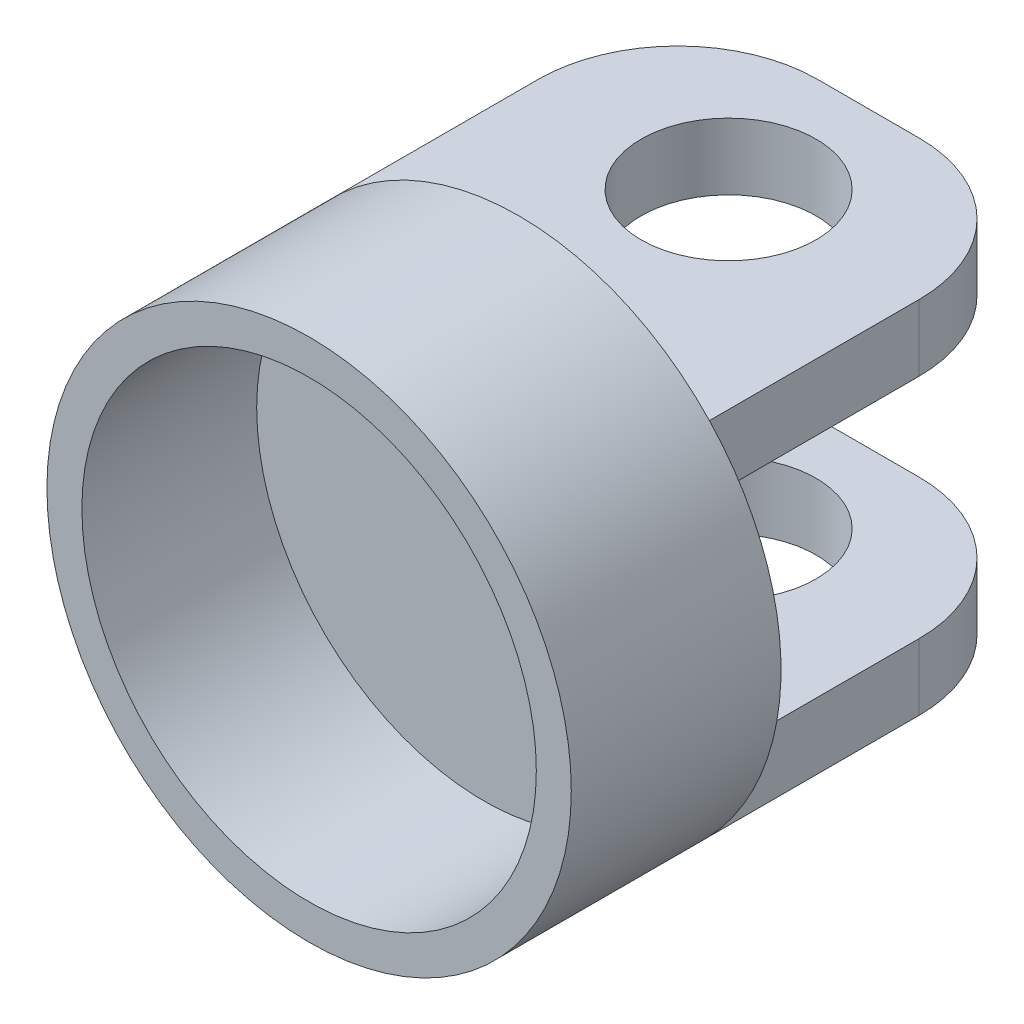
ISO-10303-21;
HEADER;
FILE_DESCRIPTION(('STEP AP214'),'2;1');
FILE_NAME('part.step','',(''),(''),'','','');
FILE_SCHEMA(('AUTOMOTIVE_DESIGN { 1 0 10303 214 1 1 1 1 }'));
ENDSEC;
DATA;
#1=APPLICATION_CONTEXT('core data for automotive mechanical design processes');
#2=APPLICATION_PROTOCOL_DEFINITION('international standard','automotive_design',2000,#1);
#3=PRODUCT_CONTEXT('',#1,'mechanical');
#4=PRODUCT('Part','Part','',(#3));
#5=PRODUCT_RELATED_PRODUCT_CATEGORY('part','',(#4));
#6=PRODUCT_DEFINITION_FORMATION('','',#4);
#7=PRODUCT_DEFINITION_CONTEXT('part definition',#1,'design');
#8=PRODUCT_DEFINITION('design','',#6,#7);
#9=PRODUCT_DEFINITION_SHAPE('','',#8);
#10=(LENGTH_UNIT() NAMED_UNIT(*) SI_UNIT(.MILLI.,.METRE.));
#11=(NAMED_UNIT(*) PLANE_ANGLE_UNIT() SI_UNIT($,.RADIAN.));
#12=(NAMED_UNIT(*) SI_UNIT($,.STERADIAN.) SOLID_ANGLE_UNIT());
#13=UNCERTAINTY_MEASURE_WITH_UNIT(LENGTH_MEASURE(1.E-05),#10,'distance_accuracy_value','');
#14=(GEOMETRIC_REPRESENTATION_CONTEXT(3) GLOBAL_UNCERTAINTY_ASSIGNED_CONTEXT((#13)) GLOBAL_UNIT_ASSIGNED_CONTEXT((#10,
#11,#12)) REPRESENTATION_CONTEXT('',''));
#15=CARTESIAN_POINT('',(0.,0.,0.));
#16=DIRECTION('',(0.,0.,1.));
#17=DIRECTION('',(1.,0.,0.));
#18=AXIS2_PLACEMENT_3D('',#15,#16,#17);
#19=CARTESIAN_POINT('',(0.,0.,-2.));
#20=DIRECTION('',(0.,0.,-1.));
#21=DIRECTION('',(-1.,0.,0.));
#22=AXIS2_PLACEMENT_3D('',#19,#20,#21);
#23=PLANE('',#22);
#24=DIRECTION('',(0.,1.,0.));
#25=VECTOR('',#24,1.);
#26=CARTESIAN_POINT('',(-10.9017957432066,0.,-2.));
#27=LINE('',#26,#25);
#28=CARTESIAN_POINT('',(-10.9017957432066,6.5,-2.));
#29=VERTEX_POINT('',#28);
#30=CARTESIAN_POINT('',(-10.9017957432066,10.3029534393494,-2.));
#31=VERTEX_POINT('',#30);
#32=EDGE_CURVE('E149',#29,#31,#27,.T.);
#33=ORIENTED_EDGE('',*,*,#32,.F.);
#34=DIRECTION('',(-1.,0.,0.));
#35=VECTOR('',#34,1.);
#36=CARTESIAN_POINT('',(0.,6.5,-2.));
#37=LINE('',#36,#35);
#38=CARTESIAN_POINT('',(10.9017957432066,6.5,-2.));
#39=VERTEX_POINT('',#38);
#40=EDGE_CURVE('E131',#39,#29,#37,.T.);
#41=ORIENTED_EDGE('',*,*,#40,.F.);
#42=DIRECTION('',(0.,1.,0.));
#43=VECTOR('',#42,1.);
#44=CARTESIAN_POINT('',(10.9017957432066,0.,-2.));
#45=LINE('',#44,#43);
#46=CARTESIAN_POINT('',(10.9017957432066,10.3029534393494,-2.));
#47=VERTEX_POINT('',#46);
#48=EDGE_CURVE('E145',#39,#47,#45,.T.);
#49=ORIENTED_EDGE('',*,*,#48,.T.);
#50=CARTESIAN_POINT('',(0.,0.,-2.));
#51=DIRECTION('',(0.,0.,-1.));
#52=DIRECTION('',(-1.,0.,0.));
#53=AXIS2_PLACEMENT_3D('',#50,#51,#52);
#54=CIRCLE('',#53,15.);
#55=CARTESIAN_POINT('',(10.9017957432066,-10.3029534393494,-2.));
#56=VERTEX_POINT('',#55);
#57=EDGE_CURVE('E193',#47,#56,#54,.T.);
#58=ORIENTED_EDGE('',*,*,#57,.T.);
#59=DIRECTION('',(0.,-1.,0.));
#60=VECTOR('',#59,1.);
#61=CARTESIAN_POINT('',(10.9017957432066,0.,-2.));
#62=LINE('',#61,#60);
#63=CARTESIAN_POINT('',(10.9017957432066,-6.5,-2.));
#64=VERTEX_POINT('',#63);
#65=EDGE_CURVE('E178',#64,#56,#62,.T.);
#66=ORIENTED_EDGE('',*,*,#65,.F.);
#67=DIRECTION('',(-1.,0.,0.));
#68=VECTOR('',#67,1.);
#69=CARTESIAN_POINT('',(0.,-6.5,-2.));
#70=LINE('',#69,#68);
#71=CARTESIAN_POINT('',(-10.9017957432066,-6.5,-2.));
#72=VERTEX_POINT('',#71);
#73=EDGE_CURVE('E168',#64,#72,#70,.T.);
#74=ORIENTED_EDGE('',*,*,#73,.T.);
#75=DIRECTION('',(0.,-1.,0.));
#76=VECTOR('',#75,1.);
#77=CARTESIAN_POINT('',(-10.9017957432066,0.,-2.));
#78=LINE('',#77,#76);
#79=CARTESIAN_POINT('',(-10.9017957432066,-10.3029534393494,-2.));
#80=VERTEX_POINT('',#79);
#81=EDGE_CURVE('E172',#72,#80,#78,.T.);
#82=ORIENTED_EDGE('',*,*,#81,.T.);
#83=EDGE_CURVE('E198',#80,#31,#54,.T.);
#84=ORIENTED_EDGE('',*,*,#83,.T.);
#85=EDGE_LOOP('',(#33,#41,#49,#58,#66,#74,#82,#84));
#86=FACE_BOUND('',#85,.T.);
#87=ADVANCED_FACE('F35',(#86),#23,.T.);
#88=DIRECTION('',(-1.,0.,0.));
#89=VECTOR('',#88,1.);
#90=CARTESIAN_POINT('',(0.,10.3029534393494,-2.));
#91=LINE('',#90,#89);
#92=EDGE_CURVE('E155',#47,#31,#91,.T.);
#93=ORIENTED_EDGE('',*,*,#92,.T.);
#94=EDGE_CURVE('E502',#31,#47,#54,.T.);
#95=ORIENTED_EDGE('',*,*,#94,.T.);
#96=EDGE_LOOP('',(#93,#95));
#97=FACE_BOUND('',#96,.T.);
#98=ADVANCED_FACE('F274',(#97),#23,.T.);
#99=CARTESIAN_POINT('',(0.,0.,10.));
#100=DIRECTION('',(0.,0.,1.));
#101=DIRECTION('',(1.,0.,0.));
#102=AXIS2_PLACEMENT_3D('',#99,#100,#101);
#103=PLANE('',#102);
#104=CARTESIAN_POINT('',(0.,0.,10.));
#105=DIRECTION('',(0.,0.,1.));
#106=DIRECTION('',(1.,0.,0.));
#107=AXIS2_PLACEMENT_3D('',#104,#105,#106);
#108=CIRCLE('',#107,15.);
#109=CARTESIAN_POINT('',(15.,0.,10.));
#110=VERTEX_POINT('',#109);
#111=EDGE_CURVE('E202',#110,#110,#108,.T.);
#112=ORIENTED_EDGE('',*,*,#111,.T.);
#113=EDGE_LOOP('',(#112));
#114=FACE_BOUND('',#113,.T.);
#115=CARTESIAN_POINT('',(0.,0.,10.));
#116=DIRECTION('',(0.,0.,1.));
#117=DIRECTION('',(1.,0.,0.));
#118=AXIS2_PLACEMENT_3D('',#115,#116,#117);
#119=CIRCLE('',#118,13.);
#120=CARTESIAN_POINT('',(13.,0.,10.));
#121=VERTEX_POINT('',#120);
#122=EDGE_CURVE('E199',#121,#121,#119,.T.);
#123=ORIENTED_EDGE('',*,*,#122,.F.);
#124=EDGE_LOOP('',(#123));
#125=FACE_BOUND('',#124,.T.);
#126=ADVANCED_FACE('F280',(#114,#125),#103,.T.);
#127=CARTESIAN_POINT('',(0.,0.,10.));
#128=DIRECTION('',(0.,0.,-1.));
#129=DIRECTION('',(-1.,0.,0.));
#130=AXIS2_PLACEMENT_3D('',#127,#128,#129);
#131=CYLINDRICAL_SURFACE('',#130,15.);
#132=ORIENTED_EDGE('',*,*,#111,.F.);
#133=EDGE_LOOP('',(#132));
#134=FACE_BOUND('',#133,.T.);
#135=EDGE_CURVE('E194',#56,#80,#54,.T.);
#136=ORIENTED_EDGE('',*,*,#135,.F.);
#137=ORIENTED_EDGE('',*,*,#57,.F.);
#138=ORIENTED_EDGE('',*,*,#94,.F.);
#139=ORIENTED_EDGE('',*,*,#83,.F.);
#140=EDGE_LOOP('',(#136,#137,#138,#139));
#141=FACE_BOUND('',#140,.T.);
#142=ADVANCED_FACE('F327',(#134,#141),#131,.T.);
#143=CARTESIAN_POINT('',(0.,0.,10.));
#144=DIRECTION('',(0.,0.,-1.));
#145=DIRECTION('',(-1.,0.,0.));
#146=AXIS2_PLACEMENT_3D('',#143,#144,#145);
#147=CYLINDRICAL_SURFACE('',#146,13.);
#148=ORIENTED_EDGE('',*,*,#122,.T.);
#149=EDGE_LOOP('',(#148));
#150=FACE_BOUND('',#149,.T.);
#151=CARTESIAN_POINT('',(0.,0.,0.));
#152=DIRECTION('',(0.,0.,1.));
#153=DIRECTION('',(1.,0.,0.));
#154=AXIS2_PLACEMENT_3D('',#151,#152,#153);
#155=CIRCLE('',#154,13.);
#156=CARTESIAN_POINT('',(13.,0.,0.));
#157=VERTEX_POINT('',#156);
#158=EDGE_CURVE('E197',#157,#157,#155,.T.);
#159=ORIENTED_EDGE('',*,*,#158,.F.);
#160=EDGE_LOOP('',(#159));
#161=FACE_BOUND('',#160,.T.);
#162=ADVANCED_FACE('F294',(#150,#161),#147,.F.);
#163=CARTESIAN_POINT('',(0.,0.,0.));
#164=DIRECTION('',(0.,0.,-1.));
#165=DIRECTION('',(-1.,0.,0.));
#166=AXIS2_PLACEMENT_3D('',#163,#164,#165);
#167=PLANE('',#166);
#168=ORIENTED_EDGE('',*,*,#158,.T.);
#169=EDGE_LOOP('',(#168));
#170=FACE_BOUND('',#169,.T.);
#171=ADVANCED_FACE('F286',(#170),#167,.F.);
#172=DIRECTION('',(-1.,0.,0.));
#173=VECTOR('',#172,1.);
#174=CARTESIAN_POINT('',(0.,-10.3029534393494,-2.));
#175=LINE('',#174,#173);
#176=EDGE_CURVE('E181',#56,#80,#175,.T.);
#177=ORIENTED_EDGE('',*,*,#176,.F.);
#178=ORIENTED_EDGE('',*,*,#135,.T.);
#179=EDGE_LOOP('',(#177,#178));
#180=FACE_BOUND('',#179,.T.);
#181=ADVANCED_FACE('F276',(#180),#23,.T.);
#182=CARTESIAN_POINT('',(0.,-6.5,-22.));
#183=DIRECTION('',(0.,1.,0.));
#184=DIRECTION('',(0.,0.,1.));
#185=AXIS2_PLACEMENT_3D('',#182,#183,#184);
#186=PLANE('',#185);
#187=CARTESIAN_POINT('',(0.,-6.5,-14.));
#188=DIRECTION('',(0.,1.,0.));
#189=DIRECTION('',(0.,0.,1.));
#190=AXIS2_PLACEMENT_3D('',#187,#188,#189);
#191=CIRCLE('',#190,5.);
#192=CARTESIAN_POINT('',(0.,-6.5,-8.99999999999999));
#193=VERTEX_POINT('',#192);
#194=EDGE_CURVE('E150',#193,#193,#191,.T.);
#195=ORIENTED_EDGE('',*,*,#194,.F.);
#196=EDGE_LOOP('',(#195));
#197=FACE_BOUND('',#196,.T.);
#198=DIRECTION('',(0.,0.,1.));
#199=VECTOR('',#198,1.);
#200=CARTESIAN_POINT('',(10.9017957432066,-6.5,-22.));
#201=LINE('',#200,#199);
#202=CARTESIAN_POINT('',(10.9017957432066,-6.5,-14.));
#203=VERTEX_POINT('',#202);
#204=EDGE_CURVE('E191',#203,#64,#201,.T.);
#205=ORIENTED_EDGE('',*,*,#204,.F.);
#206=CARTESIAN_POINT('',(2.90179574320663,-6.5,-14.));
#207=DIRECTION('',(0.,1.,0.));
#208=DIRECTION('',(0.,0.,1.));
#209=AXIS2_PLACEMENT_3D('',#206,#207,#208);
#210=CIRCLE('',#209,8.);
#211=CARTESIAN_POINT('',(2.90179574320663,-6.5,-22.));
#212=VERTEX_POINT('',#211);
#213=EDGE_CURVE('E232',#203,#212,#210,.T.);
#214=ORIENTED_EDGE('',*,*,#213,.T.);
#215=DIRECTION('',(-1.,0.,0.));
#216=VECTOR('',#215,1.);
#217=CARTESIAN_POINT('',(0.,-6.5,-22.));
#218=LINE('',#217,#216);
#219=CARTESIAN_POINT('',(-2.90179574320664,-6.5,-22.));
#220=VERTEX_POINT('',#219);
#221=EDGE_CURVE('E169',#212,#220,#218,.T.);
#222=ORIENTED_EDGE('',*,*,#221,.T.);
#223=CARTESIAN_POINT('',(-2.90179574320664,-6.5,-14.));
#224=DIRECTION('',(0.,1.,0.));
#225=DIRECTION('',(0.,0.,1.));
#226=AXIS2_PLACEMENT_3D('',#223,#224,#225);
#227=CIRCLE('',#226,8.);
#228=CARTESIAN_POINT('',(-10.9017957432066,-6.5,-14.));
#229=VERTEX_POINT('',#228);
#230=EDGE_CURVE('E50',#220,#229,#227,.T.);
#231=ORIENTED_EDGE('',*,*,#230,.T.);
#232=DIRECTION('',(0.,0.,1.));
#233=VECTOR('',#232,1.);
#234=CARTESIAN_POINT('',(-10.9017957432066,-6.5,-22.));
#235=LINE('',#234,#233);
#236=EDGE_CURVE('E175',#229,#72,#235,.T.);
#237=ORIENTED_EDGE('',*,*,#236,.T.);
#238=ORIENTED_EDGE('',*,*,#73,.F.);
#239=EDGE_LOOP('',(#205,#214,#222,#231,#237,#238));
#240=FACE_BOUND('',#239,.T.);
#241=ADVANCED_FACE('F285',(#197,#240),#186,.T.);
#242=CARTESIAN_POINT('',(10.9017957432066,0.,-22.));
#243=DIRECTION('',(-1.,0.,0.));
#244=DIRECTION('',(0.,0.,1.));
#245=AXIS2_PLACEMENT_3D('',#242,#243,#244);
#246=PLANE('',#245);
#247=DIRECTION('',(0.,0.,1.));
#248=VECTOR('',#247,1.);
#249=CARTESIAN_POINT('',(10.9017957432066,-10.3029534393494,-22.));
#250=LINE('',#249,#248);
#251=CARTESIAN_POINT('',(10.9017957432066,-10.3029534393494,-14.));
#252=VERTEX_POINT('',#251);
#253=EDGE_CURVE('E189',#252,#56,#250,.T.);
#254=ORIENTED_EDGE('',*,*,#253,.F.);
#255=DIRECTION('',(0.,-1.,0.));
#256=VECTOR('',#255,1.);
#257=CARTESIAN_POINT('',(10.9017957432066,-6.5,-14.));
#258=LINE('',#257,#256);
#259=EDGE_CURVE('E58',#252,#203,#258,.F.);
#260=ORIENTED_EDGE('',*,*,#259,.T.);
#261=ORIENTED_EDGE('',*,*,#204,.T.);
#262=ORIENTED_EDGE('',*,*,#65,.T.);
#263=EDGE_LOOP('',(#254,#260,#261,#262));
#264=FACE_BOUND('',#263,.T.);
#265=ADVANCED_FACE('F292',(#264),#246,.F.);
#266=CARTESIAN_POINT('',(0.,-10.3029534393494,-22.));
#267=DIRECTION('',(0.,1.,0.));
#268=DIRECTION('',(0.,0.,1.));
#269=AXIS2_PLACEMENT_3D('',#266,#267,#268);
#270=PLANE('',#269);
#271=CARTESIAN_POINT('',(0.,-10.3029534393494,-14.));
#272=DIRECTION('',(0.,1.,0.));
#273=DIRECTION('',(0.,0.,1.));
#274=AXIS2_PLACEMENT_3D('',#271,#272,#273);
#275=CIRCLE('',#274,5.);
#276=CARTESIAN_POINT('',(0.,-10.3029534393494,-8.99999999999999));
#277=VERTEX_POINT('',#276);
#278=EDGE_CURVE('E255',#277,#277,#275,.F.);
#279=ORIENTED_EDGE('',*,*,#278,.F.);
#280=EDGE_LOOP('',(#279));
#281=FACE_BOUND('',#280,.T.);
#282=DIRECTION('',(-1.,0.,0.));
#283=VECTOR('',#282,1.);
#284=CARTESIAN_POINT('',(0.,-10.3029534393494,-22.));
#285=LINE('',#284,#283);
#286=CARTESIAN_POINT('',(2.90179574320663,-10.3029534393494,-22.));
#287=VERTEX_POINT('',#286);
#288=CARTESIAN_POINT('',(-2.90179574320664,-10.3029534393494,-22.));
#289=VERTEX_POINT('',#288);
#290=EDGE_CURVE('E171',#287,#289,#285,.T.);
#291=ORIENTED_EDGE('',*,*,#290,.F.);
#292=CARTESIAN_POINT('',(2.90179574320663,-10.3029534393494,-14.));
#293=DIRECTION('',(0.,1.,0.));
#294=DIRECTION('',(0.,0.,1.));
#295=AXIS2_PLACEMENT_3D('',#292,#293,#294);
#296=CIRCLE('',#295,8.);
#297=EDGE_CURVE('E228',#287,#252,#296,.F.);
#298=ORIENTED_EDGE('',*,*,#297,.T.);
#299=ORIENTED_EDGE('',*,*,#253,.T.);
#300=ORIENTED_EDGE('',*,*,#176,.T.);
#301=DIRECTION('',(0.,0.,1.));
#302=VECTOR('',#301,1.);
#303=CARTESIAN_POINT('',(-10.9017957432066,-10.3029534393494,-22.));
#304=LINE('',#303,#302);
#305=CARTESIAN_POINT('',(-10.9017957432066,-10.3029534393494,-14.));
#306=VERTEX_POINT('',#305);
#307=EDGE_CURVE('E187',#306,#80,#304,.T.);
#308=ORIENTED_EDGE('',*,*,#307,.F.);
#309=CARTESIAN_POINT('',(-2.90179574320664,-10.3029534393494,-14.));
#310=DIRECTION('',(0.,1.,0.));
#311=DIRECTION('',(0.,0.,1.));
#312=AXIS2_PLACEMENT_3D('',#309,#310,#311);
#313=CIRCLE('',#312,8.);
#314=EDGE_CURVE('E226',#306,#289,#313,.F.);
#315=ORIENTED_EDGE('',*,*,#314,.T.);
#316=EDGE_LOOP('',(#291,#298,#299,#300,#308,#315));
#317=FACE_BOUND('',#316,.T.);
#318=ADVANCED_FACE('F310',(#281,#317),#270,.F.);
#319=CARTESIAN_POINT('',(-10.9017957432066,0.,-22.));
#320=DIRECTION('',(-1.,0.,0.));
#321=DIRECTION('',(0.,0.,1.));
#322=AXIS2_PLACEMENT_3D('',#319,#320,#321);
#323=PLANE('',#322);
#324=ORIENTED_EDGE('',*,*,#236,.F.);
#325=DIRECTION('',(0.,-1.,0.));
#326=VECTOR('',#325,1.);
#327=CARTESIAN_POINT('',(-10.9017957432066,0.,-14.));
#328=LINE('',#327,#326);
#329=EDGE_CURVE('E11',#229,#306,#328,.T.);
#330=ORIENTED_EDGE('',*,*,#329,.T.);
#331=ORIENTED_EDGE('',*,*,#307,.T.);
#332=ORIENTED_EDGE('',*,*,#81,.F.);
#333=EDGE_LOOP('',(#324,#330,#331,#332));
#334=FACE_BOUND('',#333,.T.);
#335=ADVANCED_FACE('F306',(#334),#323,.T.);
#336=CARTESIAN_POINT('',(0.,0.,-22.));
#337=DIRECTION('',(0.,0.,-1.));
#338=DIRECTION('',(-1.,0.,0.));
#339=AXIS2_PLACEMENT_3D('',#336,#337,#338);
#340=PLANE('',#339);
#341=ORIENTED_EDGE('',*,*,#221,.F.);
#342=DIRECTION('',(0.,-1.,0.));
#343=VECTOR('',#342,1.);
#344=CARTESIAN_POINT('',(2.90179574320663,-10.3029534393494,-22.));
#345=LINE('',#344,#343);
#346=EDGE_CURVE('E223',#212,#287,#345,.T.);
#347=ORIENTED_EDGE('',*,*,#346,.T.);
#348=ORIENTED_EDGE('',*,*,#290,.T.);
#349=DIRECTION('',(0.,-1.,0.));
#350=VECTOR('',#349,1.);
#351=CARTESIAN_POINT('',(-2.90179574320664,0.,-22.));
#352=LINE('',#351,#350);
#353=EDGE_CURVE('E221',#289,#220,#352,.F.);
#354=ORIENTED_EDGE('',*,*,#353,.T.);
#355=EDGE_LOOP('',(#341,#347,#348,#354));
#356=FACE_BOUND('',#355,.T.);
#357=ADVANCED_FACE('F313',(#356),#340,.T.);
#358=CARTESIAN_POINT('',(0.,6.5,-22.));
#359=DIRECTION('',(0.,1.,0.));
#360=DIRECTION('',(0.,0.,1.));
#361=AXIS2_PLACEMENT_3D('',#358,#359,#360);
#362=PLANE('',#361);
#363=CARTESIAN_POINT('',(0.,6.5,-14.));
#364=DIRECTION('',(0.,1.,0.));
#365=DIRECTION('',(0.,0.,1.));
#366=AXIS2_PLACEMENT_3D('',#363,#364,#365);
#367=CIRCLE('',#366,5.);
#368=CARTESIAN_POINT('',(0.,6.5,-8.99999999999999));
#369=VERTEX_POINT('',#368);
#370=EDGE_CURVE('E252',#369,#369,#367,.T.);
#371=ORIENTED_EDGE('',*,*,#370,.T.);
#372=EDGE_LOOP('',(#371));
#373=FACE_BOUND('',#372,.T.);
#374=DIRECTION('',(-1.,0.,0.));
#375=VECTOR('',#374,1.);
#376=CARTESIAN_POINT('',(0.,6.5,-22.));
#377=LINE('',#376,#375);
#378=CARTESIAN_POINT('',(2.90179574320663,6.5,-22.));
#379=VERTEX_POINT('',#378);
#380=CARTESIAN_POINT('',(-2.90179574320664,6.5,-22.));
#381=VERTEX_POINT('',#380);
#382=EDGE_CURVE('E154',#379,#381,#377,.T.);
#383=ORIENTED_EDGE('',*,*,#382,.F.);
#384=CARTESIAN_POINT('',(2.90179574320663,6.5,-14.));
#385=DIRECTION('',(0.,1.,0.));
#386=DIRECTION('',(0.,0.,1.));
#387=AXIS2_PLACEMENT_3D('',#384,#385,#386);
#388=CIRCLE('',#387,8.);
#389=CARTESIAN_POINT('',(10.9017957432066,6.5,-14.));
#390=VERTEX_POINT('',#389);
#391=EDGE_CURVE('E133',#379,#390,#388,.F.);
#392=ORIENTED_EDGE('',*,*,#391,.T.);
#393=DIRECTION('',(0.,0.,1.));
#394=VECTOR('',#393,1.);
#395=CARTESIAN_POINT('',(10.9017957432066,6.5,-22.));
#396=LINE('',#395,#394);
#397=EDGE_CURVE('E126',#390,#39,#396,.T.);
#398=ORIENTED_EDGE('',*,*,#397,.T.);
#399=ORIENTED_EDGE('',*,*,#40,.T.);
#400=DIRECTION('',(0.,0.,1.));
#401=VECTOR('',#400,1.);
#402=CARTESIAN_POINT('',(-10.9017957432066,6.5,-22.));
#403=LINE('',#402,#401);
#404=CARTESIAN_POINT('',(-10.9017957432066,6.5,-14.));
#405=VERTEX_POINT('',#404);
#406=EDGE_CURVE('E166',#405,#29,#403,.T.);
#407=ORIENTED_EDGE('',*,*,#406,.F.);
#408=CARTESIAN_POINT('',(-2.90179574320664,6.5,-14.));
#409=DIRECTION('',(0.,1.,0.));
#410=DIRECTION('',(0.,0.,1.));
#411=AXIS2_PLACEMENT_3D('',#408,#409,#410);
#412=CIRCLE('',#411,8.);
#413=EDGE_CURVE('E218',#405,#381,#412,.F.);
#414=ORIENTED_EDGE('',*,*,#413,.T.);
#415=EDGE_LOOP('',(#383,#392,#398,#399,#407,#414));
#416=FACE_BOUND('',#415,.T.);
#417=ADVANCED_FACE('F129',(#373,#416),#362,.F.);
#418=CARTESIAN_POINT('',(-10.9017957432066,0.,-22.));
#419=DIRECTION('',(1.,0.,0.));
#420=DIRECTION('',(0.,0.,-1.));
#421=AXIS2_PLACEMENT_3D('',#418,#419,#420);
#422=PLANE('',#421);
#423=DIRECTION('',(0.,0.,1.));
#424=VECTOR('',#423,1.);
#425=CARTESIAN_POINT('',(-10.9017957432066,10.3029534393494,-22.));
#426=LINE('',#425,#424);
#427=CARTESIAN_POINT('',(-10.9017957432066,10.3029534393494,-14.));
#428=VERTEX_POINT('',#427);
#429=EDGE_CURVE('E164',#428,#31,#426,.T.);
#430=ORIENTED_EDGE('',*,*,#429,.F.);
#431=DIRECTION('',(0.,1.,0.));
#432=VECTOR('',#431,1.);
#433=CARTESIAN_POINT('',(-10.9017957432066,6.5,-14.));
#434=LINE('',#433,#432);
#435=EDGE_CURVE('E43',#428,#405,#434,.F.);
#436=ORIENTED_EDGE('',*,*,#435,.T.);
#437=ORIENTED_EDGE('',*,*,#406,.T.);
#438=ORIENTED_EDGE('',*,*,#32,.T.);
#439=EDGE_LOOP('',(#430,#436,#437,#438));
#440=FACE_BOUND('',#439,.T.);
#441=ADVANCED_FACE('F236',(#440),#422,.F.);
#442=CARTESIAN_POINT('',(0.,10.3029534393494,-22.));
#443=DIRECTION('',(0.,1.,0.));
#444=DIRECTION('',(0.,0.,1.));
#445=AXIS2_PLACEMENT_3D('',#442,#443,#444);
#446=PLANE('',#445);
#447=CARTESIAN_POINT('',(0.,10.3029534393494,-14.));
#448=DIRECTION('',(0.,1.,0.));
#449=DIRECTION('',(0.,0.,1.));
#450=AXIS2_PLACEMENT_3D('',#447,#448,#449);
#451=CIRCLE('',#450,5.);
#452=CARTESIAN_POINT('',(0.,10.3029534393494,-8.99999999999999));
#453=VERTEX_POINT('',#452);
#454=EDGE_CURVE('E258',#453,#453,#451,.T.);
#455=ORIENTED_EDGE('',*,*,#454,.F.);
#456=EDGE_LOOP('',(#455));
#457=FACE_BOUND('',#456,.T.);
#458=DIRECTION('',(0.,0.,1.));
#459=VECTOR('',#458,1.);
#460=CARTESIAN_POINT('',(10.9017957432066,10.3029534393494,-22.));
#461=LINE('',#460,#459);
#462=CARTESIAN_POINT('',(10.9017957432066,10.3029534393494,-14.));
#463=VERTEX_POINT('',#462);
#464=EDGE_CURVE('E138',#463,#47,#461,.T.);
#465=ORIENTED_EDGE('',*,*,#464,.F.);
#466=CARTESIAN_POINT('',(2.90179574320663,10.3029534393494,-14.));
#467=DIRECTION('',(0.,1.,0.));
#468=DIRECTION('',(0.,0.,1.));
#469=AXIS2_PLACEMENT_3D('',#466,#467,#468);
#470=CIRCLE('',#469,8.);
#471=CARTESIAN_POINT('',(2.90179574320663,10.3029534393494,-22.));
#472=VERTEX_POINT('',#471);
#473=EDGE_CURVE('E211',#463,#472,#470,.T.);
#474=ORIENTED_EDGE('',*,*,#473,.T.);
#475=DIRECTION('',(-1.,0.,0.));
#476=VECTOR('',#475,1.);
#477=CARTESIAN_POINT('',(0.,10.3029534393494,-22.));
#478=LINE('',#477,#476);
#479=CARTESIAN_POINT('',(-2.90179574320664,10.3029534393494,-22.));
#480=VERTEX_POINT('',#479);
#481=EDGE_CURVE('E139',#472,#480,#478,.T.);
#482=ORIENTED_EDGE('',*,*,#481,.T.);
#483=CARTESIAN_POINT('',(-2.90179574320664,10.3029534393494,-14.));
#484=DIRECTION('',(0.,1.,0.));
#485=DIRECTION('',(0.,0.,1.));
#486=AXIS2_PLACEMENT_3D('',#483,#484,#485);
#487=CIRCLE('',#486,8.);
#488=EDGE_CURVE('E209',#480,#428,#487,.T.);
#489=ORIENTED_EDGE('',*,*,#488,.T.);
#490=ORIENTED_EDGE('',*,*,#429,.T.);
#491=ORIENTED_EDGE('',*,*,#92,.F.);
#492=EDGE_LOOP('',(#465,#474,#482,#489,#490,#491));
#493=FACE_BOUND('',#492,.T.);
#494=ADVANCED_FACE('F247',(#457,#493),#446,.T.);
#495=CARTESIAN_POINT('',(10.9017957432066,0.,-22.));
#496=DIRECTION('',(1.,0.,0.));
#497=DIRECTION('',(0.,0.,-1.));
#498=AXIS2_PLACEMENT_3D('',#495,#496,#497);
#499=PLANE('',#498);
#500=ORIENTED_EDGE('',*,*,#397,.F.);
#501=DIRECTION('',(0.,1.,0.));
#502=VECTOR('',#501,1.);
#503=CARTESIAN_POINT('',(10.9017957432066,0.,-14.));
#504=LINE('',#503,#502);
#505=EDGE_CURVE('E207',#390,#463,#504,.T.);
#506=ORIENTED_EDGE('',*,*,#505,.T.);
#507=ORIENTED_EDGE('',*,*,#464,.T.);
#508=ORIENTED_EDGE('',*,*,#48,.F.);
#509=EDGE_LOOP('',(#500,#506,#507,#508));
#510=FACE_BOUND('',#509,.T.);
#511=ADVANCED_FACE('F152',(#510),#499,.T.);
#512=CARTESIAN_POINT('',(0.,0.,-22.));
#513=DIRECTION('',(0.,0.,-1.));
#514=DIRECTION('',(-1.,0.,0.));
#515=AXIS2_PLACEMENT_3D('',#512,#513,#514);
#516=PLANE('',#515);
#517=ORIENTED_EDGE('',*,*,#481,.F.);
#518=DIRECTION('',(0.,1.,0.));
#519=VECTOR('',#518,1.);
#520=CARTESIAN_POINT('',(2.90179574320663,0.,-22.));
#521=LINE('',#520,#519);
#522=EDGE_CURVE('E216',#472,#379,#521,.F.);
#523=ORIENTED_EDGE('',*,*,#522,.T.);
#524=ORIENTED_EDGE('',*,*,#382,.T.);
#525=DIRECTION('',(0.,1.,0.));
#526=VECTOR('',#525,1.);
#527=CARTESIAN_POINT('',(-2.90179574320664,10.3029534393494,-22.));
#528=LINE('',#527,#526);
#529=EDGE_CURVE('E213',#381,#480,#528,.T.);
#530=ORIENTED_EDGE('',*,*,#529,.T.);
#531=EDGE_LOOP('',(#517,#523,#524,#530));
#532=FACE_BOUND('',#531,.T.);
#533=ADVANCED_FACE('F244',(#532),#516,.T.);
#534=CARTESIAN_POINT('',(2.90179574320663,0.,-14.));
#535=DIRECTION('',(0.,1.,0.));
#536=DIRECTION('',(0.,0.,1.));
#537=AXIS2_PLACEMENT_3D('',#534,#535,#536);
#538=CYLINDRICAL_SURFACE('',#537,8.);
#539=ORIENTED_EDGE('',*,*,#391,.F.);
#540=ORIENTED_EDGE('',*,*,#522,.F.);
#541=ORIENTED_EDGE('',*,*,#473,.F.);
#542=ORIENTED_EDGE('',*,*,#505,.F.);
#543=EDGE_LOOP('',(#539,#540,#541,#542));
#544=FACE_BOUND('',#543,.T.);
#545=ADVANCED_FACE('F318',(#544),#538,.T.);
#546=CARTESIAN_POINT('',(2.90179574320663,0.,-14.));
#547=DIRECTION('',(0.,1.,0.));
#548=DIRECTION('',(0.,0.,1.));
#549=AXIS2_PLACEMENT_3D('',#546,#547,#548);
#550=CYLINDRICAL_SURFACE('',#549,8.);
#551=ORIENTED_EDGE('',*,*,#213,.F.);
#552=ORIENTED_EDGE('',*,*,#259,.F.);
#553=ORIENTED_EDGE('',*,*,#297,.F.);
#554=ORIENTED_EDGE('',*,*,#346,.F.);
#555=EDGE_LOOP('',(#551,#552,#553,#554));
#556=FACE_BOUND('',#555,.T.);
#557=ADVANCED_FACE('F316',(#556),#550,.T.);
#558=CARTESIAN_POINT('',(-2.90179574320664,0.,-14.));
#559=DIRECTION('',(0.,-1.,0.));
#560=DIRECTION('',(0.,0.,-1.));
#561=AXIS2_PLACEMENT_3D('',#558,#559,#560);
#562=CYLINDRICAL_SURFACE('',#561,8.);
#563=ORIENTED_EDGE('',*,*,#413,.F.);
#564=ORIENTED_EDGE('',*,*,#435,.F.);
#565=ORIENTED_EDGE('',*,*,#488,.F.);
#566=ORIENTED_EDGE('',*,*,#529,.F.);
#567=EDGE_LOOP('',(#563,#564,#565,#566));
#568=FACE_BOUND('',#567,.T.);
#569=ADVANCED_FACE('F240',(#568),#562,.T.);
#570=CARTESIAN_POINT('',(-2.90179574320664,0.,-14.));
#571=DIRECTION('',(0.,-1.,0.));
#572=DIRECTION('',(0.,0.,-1.));
#573=AXIS2_PLACEMENT_3D('',#570,#571,#572);
#574=CYLINDRICAL_SURFACE('',#573,8.);
#575=ORIENTED_EDGE('',*,*,#230,.F.);
#576=ORIENTED_EDGE('',*,*,#353,.F.);
#577=ORIENTED_EDGE('',*,*,#314,.F.);
#578=ORIENTED_EDGE('',*,*,#329,.F.);
#579=EDGE_LOOP('',(#575,#576,#577,#578));
#580=FACE_BOUND('',#579,.T.);
#581=ADVANCED_FACE('F37',(#580),#574,.T.);
#582=CARTESIAN_POINT('',(0.,-24.4450890630804,-14.));
#583=DIRECTION('',(0.,1.,0.));
#584=DIRECTION('',(0.,0.,1.));
#585=AXIS2_PLACEMENT_3D('',#582,#583,#584);
#586=CYLINDRICAL_SURFACE('',#585,5.);
#587=ORIENTED_EDGE('',*,*,#454,.T.);
#588=EDGE_LOOP('',(#587));
#589=FACE_BOUND('',#588,.T.);
#590=ORIENTED_EDGE('',*,*,#370,.F.);
#591=EDGE_LOOP('',(#590));
#592=FACE_BOUND('',#591,.T.);
#593=ADVANCED_FACE('F262',(#589,#592),#586,.F.);
#594=ORIENTED_EDGE('',*,*,#194,.T.);
#595=EDGE_LOOP('',(#594));
#596=FACE_BOUND('',#595,.T.);
#597=ORIENTED_EDGE('',*,*,#278,.T.);
#598=EDGE_LOOP('',(#597));
#599=FACE_BOUND('',#598,.T.);
#600=ADVANCED_FACE('F472',(#596,#599),#586,.F.);
#601=CLOSED_SHELL('',(#87,#98,#126,#142,#162,#171,#181,#241,#265,#318,#335,#357,#417,#441,#494,
#511,#533,#545,#557,#569,#581,#593,#600));
#602=MANIFOLD_SOLID_BREP('B2',#601);
#603=ADVANCED_BREP_SHAPE_REPRESENTATION('',(#18,#602),#14);
#604=SHAPE_DEFINITION_REPRESENTATION(#9,#603);
ENDSEC;
END-ISO-10303-21;
